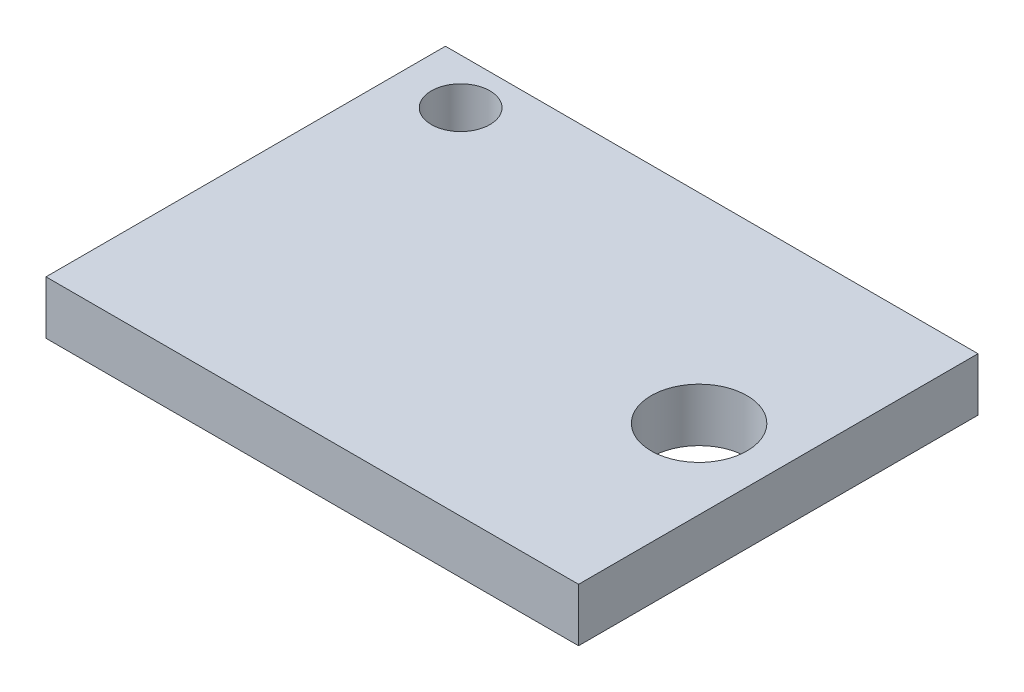
ISO-10303-21;
HEADER;
FILE_DESCRIPTION(('STEP AP214'),'2;1');
FILE_NAME('part.step','',(''),(''),'','','');
FILE_SCHEMA(('AUTOMOTIVE_DESIGN { 1 0 10303 214 1 1 1 1 }'));
ENDSEC;
DATA;
#1=APPLICATION_CONTEXT('core data for automotive mechanical design processes');
#2=APPLICATION_PROTOCOL_DEFINITION('international standard','automotive_design',2000,#1);
#3=PRODUCT_CONTEXT('',#1,'mechanical');
#4=PRODUCT('Part','Part','',(#3));
#5=PRODUCT_RELATED_PRODUCT_CATEGORY('part','',(#4));
#6=PRODUCT_DEFINITION_FORMATION('','',#4);
#7=PRODUCT_DEFINITION_CONTEXT('part definition',#1,'design');
#8=PRODUCT_DEFINITION('design','',#6,#7);
#9=PRODUCT_DEFINITION_SHAPE('','',#8);
#10=(LENGTH_UNIT() NAMED_UNIT(*) SI_UNIT(.MILLI.,.METRE.));
#11=(NAMED_UNIT(*) PLANE_ANGLE_UNIT() SI_UNIT($,.RADIAN.));
#12=(NAMED_UNIT(*) SI_UNIT($,.STERADIAN.) SOLID_ANGLE_UNIT());
#13=UNCERTAINTY_MEASURE_WITH_UNIT(LENGTH_MEASURE(1.E-05),#10,'distance_accuracy_value','');
#14=(GEOMETRIC_REPRESENTATION_CONTEXT(3) GLOBAL_UNCERTAINTY_ASSIGNED_CONTEXT((#13)) GLOBAL_UNIT_ASSIGNED_CONTEXT((#10,
#11,#12)) REPRESENTATION_CONTEXT('',''));
#15=CARTESIAN_POINT('',(0.,0.,0.));
#16=DIRECTION('',(0.,0.,1.));
#17=DIRECTION('',(1.,0.,0.));
#18=AXIS2_PLACEMENT_3D('',#15,#16,#17);
#19=CARTESIAN_POINT('',(0.,10.,0.));
#20=DIRECTION('',(0.,1.,0.));
#21=DIRECTION('',(0.,0.,1.));
#22=AXIS2_PLACEMENT_3D('',#19,#20,#21);
#23=PLANE('',#22);
#24=CARTESIAN_POINT('',(35.1304945054945,10.,0.));
#25=DIRECTION('',(0.,1.,0.));
#26=DIRECTION('',(0.,0.,1.));
#27=AXIS2_PLACEMENT_3D('',#24,#25,#26);
#28=CIRCLE('',#27,9.);
#29=CARTESIAN_POINT('',(35.1304945054945,10.,9.));
#30=VERTEX_POINT('',#29);
#31=EDGE_CURVE('E112',#30,#30,#28,.T.);
#32=ORIENTED_EDGE('',*,*,#31,.F.);
#33=EDGE_LOOP('',(#32));
#34=FACE_BOUND('',#33,.T.);
#35=DIRECTION('',(0.,0.,-1.));
#36=VECTOR('',#35,1.);
#37=CARTESIAN_POINT('',(50.,10.,-37.5));
#38=LINE('',#37,#36);
#39=CARTESIAN_POINT('',(50.,10.,37.5));
#40=VERTEX_POINT('',#39);
#41=CARTESIAN_POINT('',(50.,10.,-37.5));
#42=VERTEX_POINT('',#41);
#43=EDGE_CURVE('E91',#40,#42,#38,.T.);
#44=ORIENTED_EDGE('',*,*,#43,.T.);
#45=DIRECTION('',(-1.,0.,0.));
#46=VECTOR('',#45,1.);
#47=CARTESIAN_POINT('',(-50.,10.,-37.5));
#48=LINE('',#47,#46);
#49=CARTESIAN_POINT('',(-50.,10.,-37.5));
#50=VERTEX_POINT('',#49);
#51=EDGE_CURVE('E86',#42,#50,#48,.T.);
#52=ORIENTED_EDGE('',*,*,#51,.T.);
#53=DIRECTION('',(0.,0.,1.));
#54=VECTOR('',#53,1.);
#55=CARTESIAN_POINT('',(-50.,10.,-37.5));
#56=LINE('',#55,#54);
#57=CARTESIAN_POINT('',(-50.,10.,37.5));
#58=VERTEX_POINT('',#57);
#59=EDGE_CURVE('E89',#50,#58,#56,.T.);
#60=ORIENTED_EDGE('',*,*,#59,.T.);
#61=DIRECTION('',(1.,0.,0.));
#62=VECTOR('',#61,1.);
#63=CARTESIAN_POINT('',(-50.,10.,37.5));
#64=LINE('',#63,#62);
#65=EDGE_CURVE('E56',#58,#40,#64,.T.);
#66=ORIENTED_EDGE('',*,*,#65,.T.);
#67=EDGE_LOOP('',(#44,#52,#60,#66));
#68=FACE_BOUND('',#67,.T.);
#69=CARTESIAN_POINT('',(-38.5714285714286,10.,-28.9285714285714));
#70=DIRECTION('',(0.,1.,0.));
#71=DIRECTION('',(0.,0.,1.));
#72=AXIS2_PLACEMENT_3D('',#69,#70,#71);
#73=CIRCLE('',#72,5.5);
#74=CARTESIAN_POINT('',(-38.5714285714286,10.,-23.4285714285714));
#75=VERTEX_POINT('',#74);
#76=EDGE_CURVE('E136',#75,#75,#73,.T.);
#77=ORIENTED_EDGE('',*,*,#76,.F.);
#78=EDGE_LOOP('',(#77));
#79=FACE_BOUND('',#78,.T.);
#80=ADVANCED_FACE('F38',(#34,#68,#79),#23,.T.);
#81=CARTESIAN_POINT('',(0.,0.,0.));
#82=DIRECTION('',(0.,1.,0.));
#83=DIRECTION('',(0.,0.,1.));
#84=AXIS2_PLACEMENT_3D('',#81,#82,#83);
#85=PLANE('',#84);
#86=DIRECTION('',(0.,0.,-1.));
#87=VECTOR('',#86,1.);
#88=CARTESIAN_POINT('',(50.,0.,-37.5));
#89=LINE('',#88,#87);
#90=CARTESIAN_POINT('',(50.,0.,37.5));
#91=VERTEX_POINT('',#90);
#92=CARTESIAN_POINT('',(50.,0.,-37.5));
#93=VERTEX_POINT('',#92);
#94=EDGE_CURVE('E108',#91,#93,#89,.T.);
#95=ORIENTED_EDGE('',*,*,#94,.F.);
#96=DIRECTION('',(1.,0.,0.));
#97=VECTOR('',#96,1.);
#98=CARTESIAN_POINT('',(-50.,0.,37.5));
#99=LINE('',#98,#97);
#100=CARTESIAN_POINT('',(-50.,0.,37.5));
#101=VERTEX_POINT('',#100);
#102=EDGE_CURVE('E79',#101,#91,#99,.T.);
#103=ORIENTED_EDGE('',*,*,#102,.F.);
#104=DIRECTION('',(0.,0.,1.));
#105=VECTOR('',#104,1.);
#106=CARTESIAN_POINT('',(-50.,0.,-37.5));
#107=LINE('',#106,#105);
#108=CARTESIAN_POINT('',(-50.,0.,-37.5));
#109=VERTEX_POINT('',#108);
#110=EDGE_CURVE('E73',#109,#101,#107,.T.);
#111=ORIENTED_EDGE('',*,*,#110,.F.);
#112=DIRECTION('',(-1.,0.,0.));
#113=VECTOR('',#112,1.);
#114=CARTESIAN_POINT('',(-50.,0.,-37.5));
#115=LINE('',#114,#113);
#116=EDGE_CURVE('E96',#93,#109,#115,.T.);
#117=ORIENTED_EDGE('',*,*,#116,.F.);
#118=EDGE_LOOP('',(#95,#103,#111,#117));
#119=FACE_BOUND('',#118,.T.);
#120=CARTESIAN_POINT('',(35.1304945054945,0.,0.));
#121=DIRECTION('',(0.,1.,0.));
#122=DIRECTION('',(0.,0.,1.));
#123=AXIS2_PLACEMENT_3D('',#120,#121,#122);
#124=CIRCLE('',#123,9.);
#125=CARTESIAN_POINT('',(35.1304945054945,0.,9.));
#126=VERTEX_POINT('',#125);
#127=EDGE_CURVE('E132',#126,#126,#124,.T.);
#128=ORIENTED_EDGE('',*,*,#127,.T.);
#129=EDGE_LOOP('',(#128));
#130=FACE_BOUND('',#129,.T.);
#131=CARTESIAN_POINT('',(-38.5714285714286,0.,-28.9285714285714));
#132=DIRECTION('',(0.,1.,0.));
#133=DIRECTION('',(0.,0.,1.));
#134=AXIS2_PLACEMENT_3D('',#131,#132,#133);
#135=CIRCLE('',#134,5.5);
#136=CARTESIAN_POINT('',(-38.5714285714286,0.,-23.4285714285714));
#137=VERTEX_POINT('',#136);
#138=EDGE_CURVE('E140',#137,#137,#135,.T.);
#139=ORIENTED_EDGE('',*,*,#138,.T.);
#140=EDGE_LOOP('',(#139));
#141=FACE_BOUND('',#140,.T.);
#142=ADVANCED_FACE('F126',(#119,#130,#141),#85,.F.);
#143=CARTESIAN_POINT('',(50.,10.,-37.5));
#144=DIRECTION('',(-1.,0.,0.));
#145=DIRECTION('',(0.,0.,1.));
#146=AXIS2_PLACEMENT_3D('',#143,#144,#145);
#147=PLANE('',#146);
#148=ORIENTED_EDGE('',*,*,#94,.T.);
#149=DIRECTION('',(0.,-1.,0.));
#150=VECTOR('',#149,1.);
#151=CARTESIAN_POINT('',(50.,10.,-37.5));
#152=LINE('',#151,#150);
#153=EDGE_CURVE('E11',#42,#93,#152,.T.);
#154=ORIENTED_EDGE('',*,*,#153,.F.);
#155=ORIENTED_EDGE('',*,*,#43,.F.);
#156=DIRECTION('',(0.,-1.,0.));
#157=VECTOR('',#156,1.);
#158=CARTESIAN_POINT('',(50.,10.,37.5));
#159=LINE('',#158,#157);
#160=EDGE_CURVE('E104',#40,#91,#159,.T.);
#161=ORIENTED_EDGE('',*,*,#160,.T.);
#162=EDGE_LOOP('',(#148,#154,#155,#161));
#163=FACE_BOUND('',#162,.T.);
#164=ADVANCED_FACE('F40',(#163),#147,.F.);
#165=CARTESIAN_POINT('',(-50.,10.,-37.5));
#166=DIRECTION('',(0.,0.,1.));
#167=DIRECTION('',(1.,0.,0.));
#168=AXIS2_PLACEMENT_3D('',#165,#166,#167);
#169=PLANE('',#168);
#170=ORIENTED_EDGE('',*,*,#116,.T.);
#171=DIRECTION('',(0.,-1.,0.));
#172=VECTOR('',#171,1.);
#173=CARTESIAN_POINT('',(-50.,10.,-37.5));
#174=LINE('',#173,#172);
#175=EDGE_CURVE('E48',#50,#109,#174,.T.);
#176=ORIENTED_EDGE('',*,*,#175,.F.);
#177=ORIENTED_EDGE('',*,*,#51,.F.);
#178=ORIENTED_EDGE('',*,*,#153,.T.);
#179=EDGE_LOOP('',(#170,#176,#177,#178));
#180=FACE_BOUND('',#179,.T.);
#181=ADVANCED_FACE('F95',(#180),#169,.F.);
#182=CARTESIAN_POINT('',(-50.,10.,-37.5));
#183=DIRECTION('',(1.,0.,0.));
#184=DIRECTION('',(0.,0.,-1.));
#185=AXIS2_PLACEMENT_3D('',#182,#183,#184);
#186=PLANE('',#185);
#187=ORIENTED_EDGE('',*,*,#110,.T.);
#188=DIRECTION('',(0.,-1.,0.));
#189=VECTOR('',#188,1.);
#190=CARTESIAN_POINT('',(-50.,10.,37.5));
#191=LINE('',#190,#189);
#192=EDGE_CURVE('E98',#58,#101,#191,.T.);
#193=ORIENTED_EDGE('',*,*,#192,.F.);
#194=ORIENTED_EDGE('',*,*,#59,.F.);
#195=ORIENTED_EDGE('',*,*,#175,.T.);
#196=EDGE_LOOP('',(#187,#193,#194,#195));
#197=FACE_BOUND('',#196,.T.);
#198=ADVANCED_FACE('F99',(#197),#186,.F.);
#199=CARTESIAN_POINT('',(-50.,10.,37.5));
#200=DIRECTION('',(0.,0.,-1.));
#201=DIRECTION('',(-1.,0.,0.));
#202=AXIS2_PLACEMENT_3D('',#199,#200,#201);
#203=PLANE('',#202);
#204=ORIENTED_EDGE('',*,*,#102,.T.);
#205=ORIENTED_EDGE('',*,*,#160,.F.);
#206=ORIENTED_EDGE('',*,*,#65,.F.);
#207=ORIENTED_EDGE('',*,*,#192,.T.);
#208=EDGE_LOOP('',(#204,#205,#206,#207));
#209=FACE_BOUND('',#208,.T.);
#210=ADVANCED_FACE('F123',(#209),#203,.F.);
#211=CARTESIAN_POINT('',(35.1304945054945,10.,0.));
#212=DIRECTION('',(0.,-1.,0.));
#213=DIRECTION('',(0.,0.,-1.));
#214=AXIS2_PLACEMENT_3D('',#211,#212,#213);
#215=CYLINDRICAL_SURFACE('',#214,9.);
#216=ORIENTED_EDGE('',*,*,#31,.T.);
#217=EDGE_LOOP('',(#216));
#218=FACE_BOUND('',#217,.T.);
#219=ORIENTED_EDGE('',*,*,#127,.F.);
#220=EDGE_LOOP('',(#219));
#221=FACE_BOUND('',#220,.T.);
#222=ADVANCED_FACE('F160',(#218,#221),#215,.F.);
#223=CARTESIAN_POINT('',(-38.5714285714286,10.,-28.9285714285714));
#224=DIRECTION('',(0.,-1.,0.));
#225=DIRECTION('',(0.,0.,-1.));
#226=AXIS2_PLACEMENT_3D('',#223,#224,#225);
#227=CYLINDRICAL_SURFACE('',#226,5.5);
#228=ORIENTED_EDGE('',*,*,#76,.T.);
#229=EDGE_LOOP('',(#228));
#230=FACE_BOUND('',#229,.T.);
#231=ORIENTED_EDGE('',*,*,#138,.F.);
#232=EDGE_LOOP('',(#231));
#233=FACE_BOUND('',#232,.T.);
#234=ADVANCED_FACE('F149',(#230,#233),#227,.F.);
#235=CLOSED_SHELL('',(#80,#142,#164,#181,#198,#210,#222,#234));
#236=MANIFOLD_SOLID_BREP('B2',#235);
#237=ADVANCED_BREP_SHAPE_REPRESENTATION('',(#18,#236),#14);
#238=SHAPE_DEFINITION_REPRESENTATION(#9,#237);
ENDSEC;
END-ISO-10303-21;
